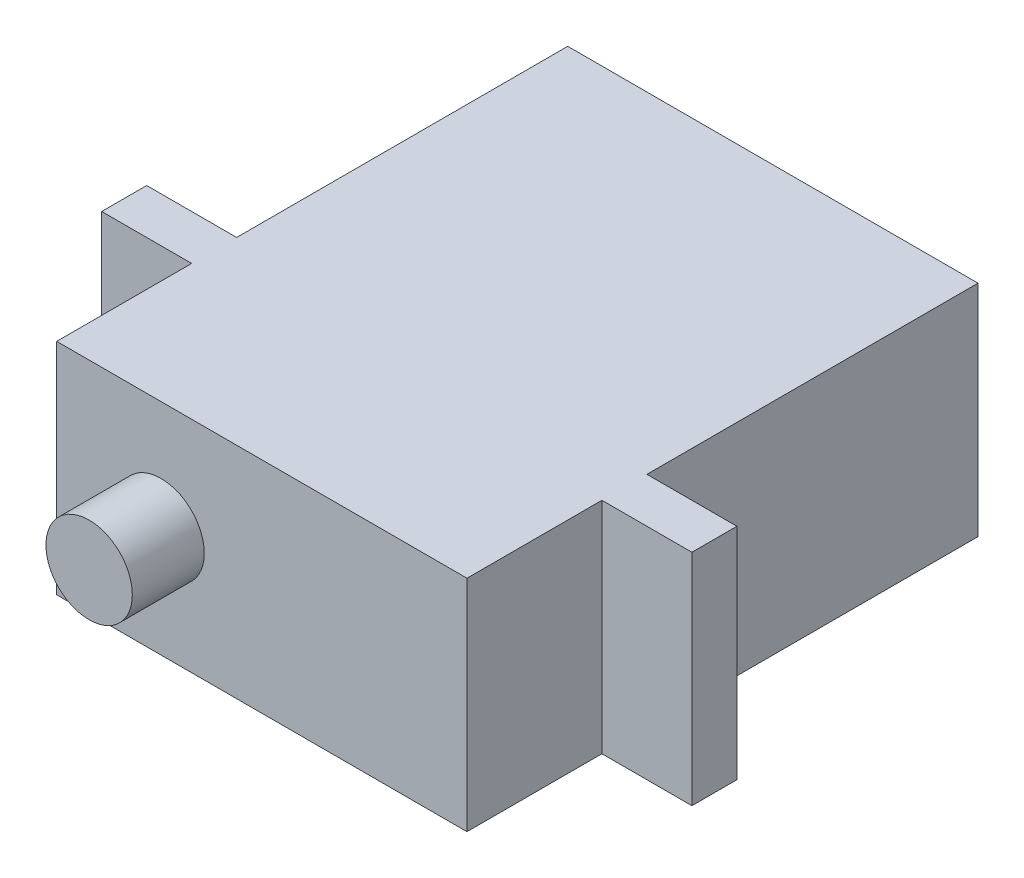
ISO-10303-21;
HEADER;
FILE_DESCRIPTION(('STEP AP214'),'2;1');
FILE_NAME('part.step','',(''),(''),'','','');
FILE_SCHEMA(('AUTOMOTIVE_DESIGN { 1 0 10303 214 1 1 1 1 }'));
ENDSEC;
DATA;
#1=APPLICATION_CONTEXT('core data for automotive mechanical design processes');
#2=APPLICATION_PROTOCOL_DEFINITION('international standard','automotive_design',2000,#1);
#3=PRODUCT_CONTEXT('',#1,'mechanical');
#4=PRODUCT('Part','Part','',(#3));
#5=PRODUCT_RELATED_PRODUCT_CATEGORY('part','',(#4));
#6=PRODUCT_DEFINITION_FORMATION('','',#4);
#7=PRODUCT_DEFINITION_CONTEXT('part definition',#1,'design');
#8=PRODUCT_DEFINITION('design','',#6,#7);
#9=PRODUCT_DEFINITION_SHAPE('','',#8);
#10=(LENGTH_UNIT() NAMED_UNIT(*) SI_UNIT(.MILLI.,.METRE.));
#11=(NAMED_UNIT(*) PLANE_ANGLE_UNIT() SI_UNIT($,.RADIAN.));
#12=(NAMED_UNIT(*) SI_UNIT($,.STERADIAN.) SOLID_ANGLE_UNIT());
#13=UNCERTAINTY_MEASURE_WITH_UNIT(LENGTH_MEASURE(1.E-05),#10,'distance_accuracy_value','');
#14=(GEOMETRIC_REPRESENTATION_CONTEXT(3) GLOBAL_UNCERTAINTY_ASSIGNED_CONTEXT((#13)) GLOBAL_UNIT_ASSIGNED_CONTEXT((#10,
#11,#12)) REPRESENTATION_CONTEXT('',''));
#15=CARTESIAN_POINT('',(0.,0.,0.));
#16=DIRECTION('',(0.,0.,1.));
#17=DIRECTION('',(1.,0.,0.));
#18=AXIS2_PLACEMENT_3D('',#15,#16,#17);
#19=CARTESIAN_POINT('',(-5.8,6.1,-4.));
#20=DIRECTION('',(1.,0.,0.));
#21=DIRECTION('',(0.,0.,-1.));
#22=AXIS2_PLACEMENT_3D('',#19,#20,#21);
#23=PLANE('',#22);
#24=DIRECTION('',(0.,-1.,0.));
#25=VECTOR('',#24,1.);
#26=CARTESIAN_POINT('',(-5.8,6.1,-14.));
#27=LINE('',#26,#25);
#28=CARTESIAN_POINT('',(-5.8,6.1,-14.));
#29=VERTEX_POINT('',#28);
#30=CARTESIAN_POINT('',(-5.8,-6.1,-14.));
#31=VERTEX_POINT('',#30);
#32=EDGE_CURVE('E54',#29,#31,#27,.T.);
#33=ORIENTED_EDGE('',*,*,#32,.F.);
#34=DIRECTION('',(0.,0.,-1.));
#35=VECTOR('',#34,1.);
#36=CARTESIAN_POINT('',(-5.8,6.1,-4.));
#37=LINE('',#36,#35);
#38=CARTESIAN_POINT('',(-5.8,6.1,-32.4));
#39=VERTEX_POINT('',#38);
#40=EDGE_CURVE('E179',#29,#39,#37,.T.);
#41=ORIENTED_EDGE('',*,*,#40,.T.);
#42=DIRECTION('',(0.,-1.,0.));
#43=VECTOR('',#42,1.);
#44=CARTESIAN_POINT('',(-5.8,6.1,-32.4));
#45=LINE('',#44,#43);
#46=CARTESIAN_POINT('',(-5.8,-6.1,-32.4));
#47=VERTEX_POINT('',#46);
#48=EDGE_CURVE('E167',#39,#47,#45,.T.);
#49=ORIENTED_EDGE('',*,*,#48,.T.);
#50=DIRECTION('',(0.,0.,-1.));
#51=VECTOR('',#50,1.);
#52=CARTESIAN_POINT('',(-5.8,-6.1,-4.));
#53=LINE('',#52,#51);
#54=EDGE_CURVE('E198',#31,#47,#53,.T.);
#55=ORIENTED_EDGE('',*,*,#54,.F.);
#56=EDGE_LOOP('',(#33,#41,#49,#55));
#57=FACE_BOUND('',#56,.T.);
#58=ADVANCED_FACE('F39',(#57),#23,.F.);
#59=CARTESIAN_POINT('',(17.,-6.1,-4.));
#60=DIRECTION('',(-1.,0.,0.));
#61=DIRECTION('',(0.,0.,1.));
#62=AXIS2_PLACEMENT_3D('',#59,#60,#61);
#63=PLANE('',#62);
#64=DIRECTION('',(0.,1.,0.));
#65=VECTOR('',#64,1.);
#66=CARTESIAN_POINT('',(17.,-6.1,-14.));
#67=LINE('',#66,#65);
#68=CARTESIAN_POINT('',(17.,-6.1,-14.));
#69=VERTEX_POINT('',#68);
#70=CARTESIAN_POINT('',(17.,6.1,-14.));
#71=VERTEX_POINT('',#70);
#72=EDGE_CURVE('E48',#69,#71,#67,.T.);
#73=ORIENTED_EDGE('',*,*,#72,.F.);
#74=DIRECTION('',(0.,0.,-1.));
#75=VECTOR('',#74,1.);
#76=CARTESIAN_POINT('',(17.,-6.1,-4.));
#77=LINE('',#76,#75);
#78=CARTESIAN_POINT('',(17.,-6.1,-32.4));
#79=VERTEX_POINT('',#78);
#80=EDGE_CURVE('E195',#69,#79,#77,.T.);
#81=ORIENTED_EDGE('',*,*,#80,.T.);
#82=DIRECTION('',(0.,1.,0.));
#83=VECTOR('',#82,1.);
#84=CARTESIAN_POINT('',(17.,-6.1,-32.4));
#85=LINE('',#84,#83);
#86=CARTESIAN_POINT('',(17.,6.1,-32.4));
#87=VERTEX_POINT('',#86);
#88=EDGE_CURVE('E181',#79,#87,#85,.T.);
#89=ORIENTED_EDGE('',*,*,#88,.T.);
#90=DIRECTION('',(0.,0.,-1.));
#91=VECTOR('',#90,1.);
#92=CARTESIAN_POINT('',(17.,6.1,-4.));
#93=LINE('',#92,#91);
#94=EDGE_CURVE('E188',#71,#87,#93,.T.);
#95=ORIENTED_EDGE('',*,*,#94,.F.);
#96=EDGE_LOOP('',(#73,#81,#89,#95));
#97=FACE_BOUND('',#96,.T.);
#98=ADVANCED_FACE('F261',(#97),#63,.F.);
#99=CARTESIAN_POINT('',(-5.8,6.1,-4.));
#100=VERTEX_POINT('',#99);
#101=CARTESIAN_POINT('',(-5.8,6.1,-11.5));
#102=VERTEX_POINT('',#101);
#103=EDGE_CURVE('E65',#100,#102,#37,.T.);
#104=ORIENTED_EDGE('',*,*,#103,.T.);
#105=DIRECTION('',(0.,-1.,0.));
#106=VECTOR('',#105,1.);
#107=CARTESIAN_POINT('',(-5.8,6.1,-11.5));
#108=LINE('',#107,#106);
#109=CARTESIAN_POINT('',(-5.8,-6.1,-11.5));
#110=VERTEX_POINT('',#109);
#111=EDGE_CURVE('E158',#102,#110,#108,.T.);
#112=ORIENTED_EDGE('',*,*,#111,.T.);
#113=CARTESIAN_POINT('',(-5.8,-6.1,-4.));
#114=VERTEX_POINT('',#113);
#115=EDGE_CURVE('E140',#114,#110,#53,.T.);
#116=ORIENTED_EDGE('',*,*,#115,.F.);
#117=DIRECTION('',(0.,-1.,0.));
#118=VECTOR('',#117,1.);
#119=CARTESIAN_POINT('',(-5.8,6.1,-4.));
#120=LINE('',#119,#118);
#121=EDGE_CURVE('E170',#100,#114,#120,.T.);
#122=ORIENTED_EDGE('',*,*,#121,.F.);
#123=EDGE_LOOP('',(#104,#112,#116,#122));
#124=FACE_BOUND('',#123,.T.);
#125=ADVANCED_FACE('F41',(#124),#23,.F.);
#126=CARTESIAN_POINT('',(-5.8,-6.1,-4.));
#127=DIRECTION('',(0.,1.,0.));
#128=DIRECTION('',(0.,0.,1.));
#129=AXIS2_PLACEMENT_3D('',#126,#127,#128);
#130=PLANE('',#129);
#131=ORIENTED_EDGE('',*,*,#115,.T.);
#132=DIRECTION('',(1.,0.,0.));
#133=VECTOR('',#132,1.);
#134=CARTESIAN_POINT('',(-10.8,-6.1,-11.5));
#135=LINE('',#134,#133);
#136=CARTESIAN_POINT('',(-10.8,-6.1,-11.5));
#137=VERTEX_POINT('',#136);
#138=EDGE_CURVE('E128',#137,#110,#135,.T.);
#139=ORIENTED_EDGE('',*,*,#138,.F.);
#140=DIRECTION('',(0.,0.,-1.));
#141=VECTOR('',#140,1.);
#142=CARTESIAN_POINT('',(-10.8,-6.1,-11.5));
#143=LINE('',#142,#141);
#144=CARTESIAN_POINT('',(-10.8,-6.1,-14.));
#145=VERTEX_POINT('',#144);
#146=EDGE_CURVE('E132',#137,#145,#143,.T.);
#147=ORIENTED_EDGE('',*,*,#146,.T.);
#148=DIRECTION('',(1.,0.,0.));
#149=VECTOR('',#148,1.);
#150=CARTESIAN_POINT('',(-10.8,-6.1,-14.));
#151=LINE('',#150,#149);
#152=EDGE_CURVE('E226',#145,#31,#151,.T.);
#153=ORIENTED_EDGE('',*,*,#152,.T.);
#154=ORIENTED_EDGE('',*,*,#54,.T.);
#155=DIRECTION('',(1.,0.,0.));
#156=VECTOR('',#155,1.);
#157=CARTESIAN_POINT('',(-5.8,-6.1,-32.4));
#158=LINE('',#157,#156);
#159=EDGE_CURVE('E178',#47,#79,#158,.T.);
#160=ORIENTED_EDGE('',*,*,#159,.T.);
#161=ORIENTED_EDGE('',*,*,#80,.F.);
#162=CARTESIAN_POINT('',(22.,-6.1,-14.));
#163=VERTEX_POINT('',#162);
#164=EDGE_CURVE('E202',#69,#163,#151,.T.);
#165=ORIENTED_EDGE('',*,*,#164,.T.);
#166=DIRECTION('',(0.,0.,-1.));
#167=VECTOR('',#166,1.);
#168=CARTESIAN_POINT('',(22.,-6.1,-11.5));
#169=LINE('',#168,#167);
#170=CARTESIAN_POINT('',(22.,-6.1,-11.5));
#171=VERTEX_POINT('',#170);
#172=EDGE_CURVE('E156',#171,#163,#169,.T.);
#173=ORIENTED_EDGE('',*,*,#172,.F.);
#174=CARTESIAN_POINT('',(17.,-6.1,-11.5));
#175=VERTEX_POINT('',#174);
#176=EDGE_CURVE('E143',#175,#171,#135,.T.);
#177=ORIENTED_EDGE('',*,*,#176,.F.);
#178=CARTESIAN_POINT('',(17.,-6.1,-4.));
#179=VERTEX_POINT('',#178);
#180=EDGE_CURVE('E191',#179,#175,#77,.T.);
#181=ORIENTED_EDGE('',*,*,#180,.F.);
#182=DIRECTION('',(1.,0.,0.));
#183=VECTOR('',#182,1.);
#184=CARTESIAN_POINT('',(-5.8,-6.1,-4.));
#185=LINE('',#184,#183);
#186=EDGE_CURVE('E168',#114,#179,#185,.T.);
#187=ORIENTED_EDGE('',*,*,#186,.F.);
#188=EDGE_LOOP('',(#131,#139,#147,#153,#154,#160,#161,#165,#173,#177,#181,#187));
#189=FACE_BOUND('',#188,.T.);
#190=ADVANCED_FACE('F131',(#189),#130,.F.);
#191=ORIENTED_EDGE('',*,*,#180,.T.);
#192=DIRECTION('',(0.,1.,0.));
#193=VECTOR('',#192,1.);
#194=CARTESIAN_POINT('',(17.,-6.1,-11.5));
#195=LINE('',#194,#193);
#196=CARTESIAN_POINT('',(17.,6.1,-11.5));
#197=VERTEX_POINT('',#196);
#198=EDGE_CURVE('E11',#175,#197,#195,.T.);
#199=ORIENTED_EDGE('',*,*,#198,.T.);
#200=CARTESIAN_POINT('',(17.,6.1,-4.));
#201=VERTEX_POINT('',#200);
#202=EDGE_CURVE('E187',#201,#197,#93,.T.);
#203=ORIENTED_EDGE('',*,*,#202,.F.);
#204=DIRECTION('',(0.,1.,0.));
#205=VECTOR('',#204,1.);
#206=CARTESIAN_POINT('',(17.,-6.1,-4.));
#207=LINE('',#206,#205);
#208=EDGE_CURVE('E175',#179,#201,#207,.T.);
#209=ORIENTED_EDGE('',*,*,#208,.F.);
#210=EDGE_LOOP('',(#191,#199,#203,#209));
#211=FACE_BOUND('',#210,.T.);
#212=ADVANCED_FACE('F270',(#211),#63,.F.);
#213=CARTESIAN_POINT('',(17.,6.1,-4.));
#214=DIRECTION('',(0.,-1.,0.));
#215=DIRECTION('',(0.,0.,-1.));
#216=AXIS2_PLACEMENT_3D('',#213,#214,#215);
#217=PLANE('',#216);
#218=ORIENTED_EDGE('',*,*,#202,.T.);
#219=DIRECTION('',(-1.,0.,0.));
#220=VECTOR('',#219,1.);
#221=CARTESIAN_POINT('',(22.,6.1,-11.5));
#222=LINE('',#221,#220);
#223=CARTESIAN_POINT('',(22.,6.1,-11.5));
#224=VERTEX_POINT('',#223);
#225=EDGE_CURVE('E219',#224,#197,#222,.T.);
#226=ORIENTED_EDGE('',*,*,#225,.F.);
#227=DIRECTION('',(0.,0.,-1.));
#228=VECTOR('',#227,1.);
#229=CARTESIAN_POINT('',(22.,6.1,-11.5));
#230=LINE('',#229,#228);
#231=CARTESIAN_POINT('',(22.,6.1,-14.));
#232=VERTEX_POINT('',#231);
#233=EDGE_CURVE('E161',#224,#232,#230,.T.);
#234=ORIENTED_EDGE('',*,*,#233,.T.);
#235=DIRECTION('',(-1.,0.,0.));
#236=VECTOR('',#235,1.);
#237=CARTESIAN_POINT('',(22.,6.1,-14.));
#238=LINE('',#237,#236);
#239=EDGE_CURVE('E151',#232,#71,#238,.T.);
#240=ORIENTED_EDGE('',*,*,#239,.T.);
#241=ORIENTED_EDGE('',*,*,#94,.T.);
#242=DIRECTION('',(-1.,0.,0.));
#243=VECTOR('',#242,1.);
#244=CARTESIAN_POINT('',(17.,6.1,-32.4));
#245=LINE('',#244,#243);
#246=EDGE_CURVE('E174',#87,#39,#245,.T.);
#247=ORIENTED_EDGE('',*,*,#246,.T.);
#248=ORIENTED_EDGE('',*,*,#40,.F.);
#249=CARTESIAN_POINT('',(-10.8,6.1,-14.));
#250=VERTEX_POINT('',#249);
#251=EDGE_CURVE('E213',#29,#250,#238,.T.);
#252=ORIENTED_EDGE('',*,*,#251,.T.);
#253=DIRECTION('',(0.,0.,-1.));
#254=VECTOR('',#253,1.);
#255=CARTESIAN_POINT('',(-10.8,6.1,-11.5));
#256=LINE('',#255,#254);
#257=CARTESIAN_POINT('',(-10.8,6.1,-11.5));
#258=VERTEX_POINT('',#257);
#259=EDGE_CURVE('E218',#258,#250,#256,.T.);
#260=ORIENTED_EDGE('',*,*,#259,.F.);
#261=EDGE_CURVE('E150',#102,#258,#222,.T.);
#262=ORIENTED_EDGE('',*,*,#261,.F.);
#263=ORIENTED_EDGE('',*,*,#103,.F.);
#264=DIRECTION('',(-1.,0.,0.));
#265=VECTOR('',#264,1.);
#266=CARTESIAN_POINT('',(17.,6.1,-4.));
#267=LINE('',#266,#265);
#268=EDGE_CURVE('E172',#201,#100,#267,.T.);
#269=ORIENTED_EDGE('',*,*,#268,.F.);
#270=EDGE_LOOP('',(#218,#226,#234,#240,#241,#247,#248,#252,#260,#262,#263,#269));
#271=FACE_BOUND('',#270,.T.);
#272=ADVANCED_FACE('F209',(#271),#217,.F.);
#273=CARTESIAN_POINT('',(0.,0.,-4.));
#274=DIRECTION('',(0.,0.,1.));
#275=DIRECTION('',(1.,0.,0.));
#276=AXIS2_PLACEMENT_3D('',#273,#274,#275);
#277=PLANE('',#276);
#278=CARTESIAN_POINT('',(0.,0.,-4.));
#279=DIRECTION('',(0.,0.,1.));
#280=DIRECTION('',(1.,0.,0.));
#281=AXIS2_PLACEMENT_3D('',#278,#279,#280);
#282=CIRCLE('',#281,2.4);
#283=CARTESIAN_POINT('',(2.4,0.,-4.));
#284=VERTEX_POINT('',#283);
#285=EDGE_CURVE('E43',#284,#284,#282,.F.);
#286=ORIENTED_EDGE('',*,*,#285,.T.);
#287=EDGE_LOOP('',(#286));
#288=FACE_BOUND('',#287,.T.);
#289=ORIENTED_EDGE('',*,*,#121,.T.);
#290=ORIENTED_EDGE('',*,*,#186,.T.);
#291=ORIENTED_EDGE('',*,*,#208,.T.);
#292=ORIENTED_EDGE('',*,*,#268,.T.);
#293=EDGE_LOOP('',(#289,#290,#291,#292));
#294=FACE_BOUND('',#293,.T.);
#295=ADVANCED_FACE('F245',(#288,#294),#277,.T.);
#296=CARTESIAN_POINT('',(0.,0.,-32.4));
#297=DIRECTION('',(0.,0.,1.));
#298=DIRECTION('',(1.,0.,0.));
#299=AXIS2_PLACEMENT_3D('',#296,#297,#298);
#300=PLANE('',#299);
#301=ORIENTED_EDGE('',*,*,#48,.F.);
#302=ORIENTED_EDGE('',*,*,#246,.F.);
#303=ORIENTED_EDGE('',*,*,#88,.F.);
#304=ORIENTED_EDGE('',*,*,#159,.F.);
#305=EDGE_LOOP('',(#301,#302,#303,#304));
#306=FACE_BOUND('',#305,.T.);
#307=ADVANCED_FACE('F276',(#306),#300,.F.);
#308=CARTESIAN_POINT('',(22.,-6.1,-11.5));
#309=DIRECTION('',(-1.,0.,0.));
#310=DIRECTION('',(0.,0.,1.));
#311=AXIS2_PLACEMENT_3D('',#308,#309,#310);
#312=PLANE('',#311);
#313=DIRECTION('',(0.,1.,0.));
#314=VECTOR('',#313,1.);
#315=CARTESIAN_POINT('',(22.,-6.1,-14.));
#316=LINE('',#315,#314);
#317=EDGE_CURVE('E214',#163,#232,#316,.T.);
#318=ORIENTED_EDGE('',*,*,#317,.T.);
#319=ORIENTED_EDGE('',*,*,#233,.F.);
#320=DIRECTION('',(0.,1.,0.));
#321=VECTOR('',#320,1.);
#322=CARTESIAN_POINT('',(22.,-6.1,-11.5));
#323=LINE('',#322,#321);
#324=EDGE_CURVE('E138',#171,#224,#323,.T.);
#325=ORIENTED_EDGE('',*,*,#324,.F.);
#326=ORIENTED_EDGE('',*,*,#172,.T.);
#327=EDGE_LOOP('',(#318,#319,#325,#326));
#328=FACE_BOUND('',#327,.T.);
#329=ADVANCED_FACE('F234',(#328),#312,.F.);
#330=CARTESIAN_POINT('',(0.,0.,-14.));
#331=DIRECTION('',(0.,0.,1.));
#332=DIRECTION('',(1.,0.,0.));
#333=AXIS2_PLACEMENT_3D('',#330,#331,#332);
#334=PLANE('',#333);
#335=ORIENTED_EDGE('',*,*,#164,.F.);
#336=ORIENTED_EDGE('',*,*,#72,.T.);
#337=ORIENTED_EDGE('',*,*,#239,.F.);
#338=ORIENTED_EDGE('',*,*,#317,.F.);
#339=EDGE_LOOP('',(#335,#336,#337,#338));
#340=FACE_BOUND('',#339,.T.);
#341=ADVANCED_FACE('F201',(#340),#334,.F.);
#342=CARTESIAN_POINT('',(0.,0.,-11.5));
#343=DIRECTION('',(0.,0.,1.));
#344=DIRECTION('',(1.,0.,0.));
#345=AXIS2_PLACEMENT_3D('',#342,#343,#344);
#346=PLANE('',#345);
#347=ORIENTED_EDGE('',*,*,#198,.F.);
#348=ORIENTED_EDGE('',*,*,#176,.T.);
#349=ORIENTED_EDGE('',*,*,#324,.T.);
#350=ORIENTED_EDGE('',*,*,#225,.T.);
#351=EDGE_LOOP('',(#347,#348,#349,#350));
#352=FACE_BOUND('',#351,.T.);
#353=ADVANCED_FACE('F235',(#352),#346,.T.);
#354=ORIENTED_EDGE('',*,*,#111,.F.);
#355=ORIENTED_EDGE('',*,*,#261,.T.);
#356=DIRECTION('',(0.,-1.,0.));
#357=VECTOR('',#356,1.);
#358=CARTESIAN_POINT('',(-10.8,6.1,-11.5));
#359=LINE('',#358,#357);
#360=EDGE_CURVE('E145',#258,#137,#359,.T.);
#361=ORIENTED_EDGE('',*,*,#360,.T.);
#362=ORIENTED_EDGE('',*,*,#138,.T.);
#363=EDGE_LOOP('',(#354,#355,#361,#362));
#364=FACE_BOUND('',#363,.T.);
#365=ADVANCED_FACE('F144',(#364),#346,.T.);
#366=ORIENTED_EDGE('',*,*,#251,.F.);
#367=ORIENTED_EDGE('',*,*,#32,.T.);
#368=ORIENTED_EDGE('',*,*,#152,.F.);
#369=DIRECTION('',(0.,-1.,0.));
#370=VECTOR('',#369,1.);
#371=CARTESIAN_POINT('',(-10.8,6.1,-14.));
#372=LINE('',#371,#370);
#373=EDGE_CURVE('E154',#250,#145,#372,.T.);
#374=ORIENTED_EDGE('',*,*,#373,.F.);
#375=EDGE_LOOP('',(#366,#367,#368,#374));
#376=FACE_BOUND('',#375,.T.);
#377=ADVANCED_FACE('F260',(#376),#334,.F.);
#378=CARTESIAN_POINT('',(-10.8,6.1,-11.5));
#379=DIRECTION('',(1.,0.,0.));
#380=DIRECTION('',(0.,0.,-1.));
#381=AXIS2_PLACEMENT_3D('',#378,#379,#380);
#382=PLANE('',#381);
#383=ORIENTED_EDGE('',*,*,#373,.T.);
#384=ORIENTED_EDGE('',*,*,#146,.F.);
#385=ORIENTED_EDGE('',*,*,#360,.F.);
#386=ORIENTED_EDGE('',*,*,#259,.T.);
#387=EDGE_LOOP('',(#383,#384,#385,#386));
#388=FACE_BOUND('',#387,.T.);
#389=ADVANCED_FACE('F153',(#388),#382,.F.);
#390=CARTESIAN_POINT('',(0.,0.,0.));
#391=DIRECTION('',(0.,0.,-1.));
#392=DIRECTION('',(-1.,0.,0.));
#393=AXIS2_PLACEMENT_3D('',#390,#391,#392);
#394=CYLINDRICAL_SURFACE('',#393,2.4);
#395=ORIENTED_EDGE('',*,*,#285,.F.);
#396=EDGE_LOOP('',(#395));
#397=FACE_BOUND('',#396,.T.);
#398=CARTESIAN_POINT('',(0.,0.,0.));
#399=DIRECTION('',(0.,0.,1.));
#400=DIRECTION('',(1.,0.,0.));
#401=AXIS2_PLACEMENT_3D('',#398,#399,#400);
#402=CIRCLE('',#401,2.4);
#403=CARTESIAN_POINT('',(2.4,0.,0.));
#404=VERTEX_POINT('',#403);
#405=EDGE_CURVE('E237',#404,#404,#402,.T.);
#406=ORIENTED_EDGE('',*,*,#405,.F.);
#407=EDGE_LOOP('',(#406));
#408=FACE_BOUND('',#407,.T.);
#409=ADVANCED_FACE('F247',(#397,#408),#394,.T.);
#410=CARTESIAN_POINT('',(0.,0.,0.));
#411=DIRECTION('',(0.,0.,1.));
#412=DIRECTION('',(1.,0.,0.));
#413=AXIS2_PLACEMENT_3D('',#410,#411,#412);
#414=PLANE('',#413);
#415=ORIENTED_EDGE('',*,*,#405,.T.);
#416=EDGE_LOOP('',(#415));
#417=FACE_BOUND('',#416,.T.);
#418=ADVANCED_FACE('F246',(#417),#414,.T.);
#419=CLOSED_SHELL('',(#58,#98,#125,#190,#212,#272,#295,#307,#329,#341,#353,#365,#377,#389,#409,#418));
#420=MANIFOLD_SOLID_BREP('B2',#419);
#421=ADVANCED_BREP_SHAPE_REPRESENTATION('',(#18,#420),#14);
#422=SHAPE_DEFINITION_REPRESENTATION(#9,#421);
ENDSEC;
END-ISO-10303-21;
